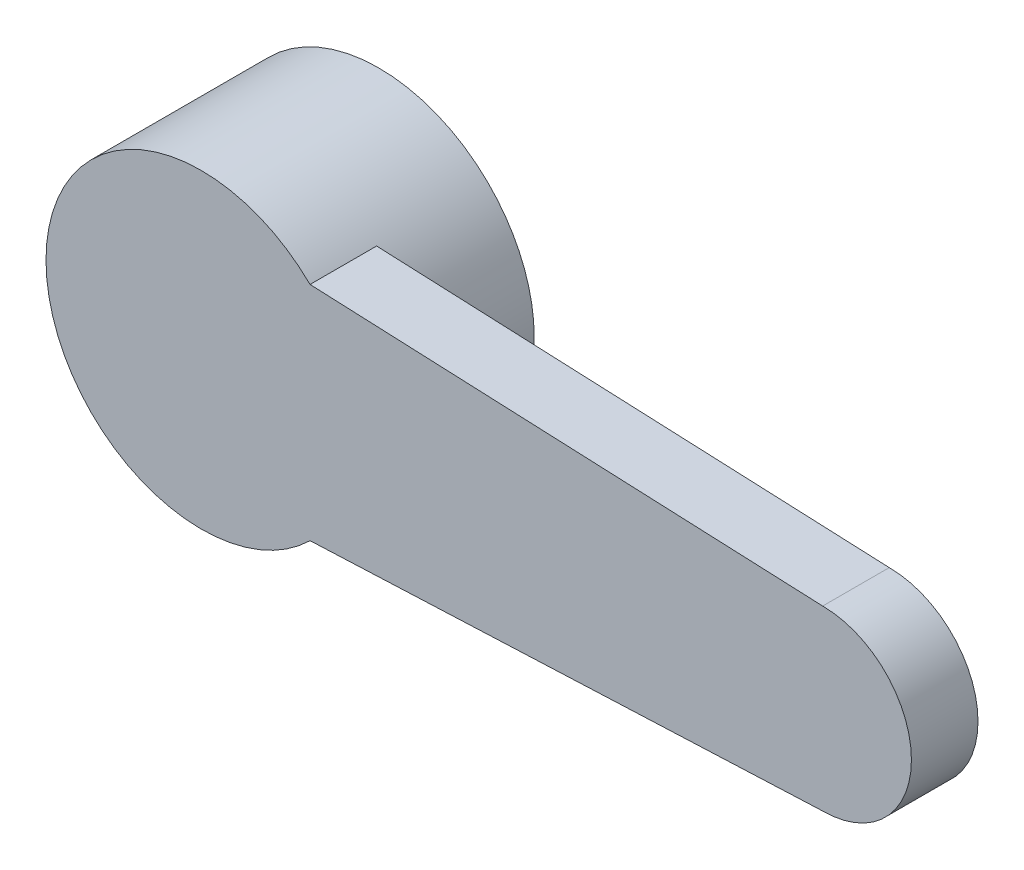
ISO-10303-21;
HEADER;
FILE_DESCRIPTION(('STEP AP214'),'2;1');
FILE_NAME('part.step','',(''),(''),'','','');
FILE_SCHEMA(('AUTOMOTIVE_DESIGN { 1 0 10303 214 1 1 1 1 }'));
ENDSEC;
DATA;
#1=APPLICATION_CONTEXT('core data for automotive mechanical design processes');
#2=APPLICATION_PROTOCOL_DEFINITION('international standard','automotive_design',2000,#1);
#3=PRODUCT_CONTEXT('',#1,'mechanical');
#4=PRODUCT('Part','Part','',(#3));
#5=PRODUCT_RELATED_PRODUCT_CATEGORY('part','',(#4));
#6=PRODUCT_DEFINITION_FORMATION('','',#4);
#7=PRODUCT_DEFINITION_CONTEXT('part definition',#1,'design');
#8=PRODUCT_DEFINITION('design','',#6,#7);
#9=PRODUCT_DEFINITION_SHAPE('','',#8);
#10=(LENGTH_UNIT() NAMED_UNIT(*) SI_UNIT(.MILLI.,.METRE.));
#11=(NAMED_UNIT(*) PLANE_ANGLE_UNIT() SI_UNIT($,.RADIAN.));
#12=(NAMED_UNIT(*) SI_UNIT($,.STERADIAN.) SOLID_ANGLE_UNIT());
#13=UNCERTAINTY_MEASURE_WITH_UNIT(LENGTH_MEASURE(1.E-05),#10,'distance_accuracy_value','');
#14=(GEOMETRIC_REPRESENTATION_CONTEXT(3) GLOBAL_UNCERTAINTY_ASSIGNED_CONTEXT((#13)) GLOBAL_UNIT_ASSIGNED_CONTEXT((#10,
#11,#12)) REPRESENTATION_CONTEXT('',''));
#15=CARTESIAN_POINT('',(0.,0.,0.));
#16=DIRECTION('',(0.,0.,1.));
#17=DIRECTION('',(1.,0.,0.));
#18=AXIS2_PLACEMENT_3D('',#15,#16,#17);
#19=CARTESIAN_POINT('',(0.,0.,4.));
#20=DIRECTION('',(0.,0.,-1.));
#21=DIRECTION('',(-1.,0.,0.));
#22=AXIS2_PLACEMENT_3D('',#19,#20,#21);
#23=CYLINDRICAL_SURFACE('',#22,3.5);
#24=CARTESIAN_POINT('',(0.,0.,4.));
#25=DIRECTION('',(0.,0.,1.));
#26=DIRECTION('',(1.,0.,0.));
#27=AXIS2_PLACEMENT_3D('',#24,#25,#26);
#28=CIRCLE('',#27,3.5);
#29=CARTESIAN_POINT('',(2.44948974278318,2.5,4.));
#30=VERTEX_POINT('',#29);
#31=CARTESIAN_POINT('',(2.44948974278318,-2.5,4.));
#32=VERTEX_POINT('',#31);
#33=EDGE_CURVE('E42',#30,#32,#28,.T.);
#34=ORIENTED_EDGE('',*,*,#33,.F.);
#35=DIRECTION('',(0.,0.,1.));
#36=VECTOR('',#35,1.);
#37=CARTESIAN_POINT('',(2.44948974278318,2.5,2.5));
#38=LINE('',#37,#36);
#39=CARTESIAN_POINT('',(2.44948974278318,2.5,2.5));
#40=VERTEX_POINT('',#39);
#41=EDGE_CURVE('E101',#40,#30,#38,.T.);
#42=ORIENTED_EDGE('',*,*,#41,.F.);
#43=CARTESIAN_POINT('',(0.,0.,2.5));
#44=DIRECTION('',(0.,0.,-1.));
#45=DIRECTION('',(-1.,0.,0.));
#46=AXIS2_PLACEMENT_3D('',#43,#44,#45);
#47=CIRCLE('',#46,3.5);
#48=CARTESIAN_POINT('',(2.44948974278318,-2.5,2.5));
#49=VERTEX_POINT('',#48);
#50=EDGE_CURVE('E11',#40,#49,#47,.T.);
#51=ORIENTED_EDGE('',*,*,#50,.T.);
#52=DIRECTION('',(0.,0.,1.));
#53=VECTOR('',#52,1.);
#54=CARTESIAN_POINT('',(2.44948974278318,-2.5,2.5));
#55=LINE('',#54,#53);
#56=EDGE_CURVE('E80',#49,#32,#55,.T.);
#57=ORIENTED_EDGE('',*,*,#56,.T.);
#58=EDGE_LOOP('',(#34,#42,#51,#57));
#59=FACE_BOUND('',#58,.T.);
#60=CARTESIAN_POINT('',(0.,0.,0.));
#61=DIRECTION('',(0.,0.,1.));
#62=DIRECTION('',(1.,0.,0.));
#63=AXIS2_PLACEMENT_3D('',#60,#61,#62);
#64=CIRCLE('',#63,3.5);
#65=CARTESIAN_POINT('',(3.5,0.,0.));
#66=VERTEX_POINT('',#65);
#67=EDGE_CURVE('E103',#66,#66,#64,.T.);
#68=ORIENTED_EDGE('',*,*,#67,.T.);
#69=EDGE_LOOP('',(#68));
#70=FACE_BOUND('',#69,.T.);
#71=ADVANCED_FACE('F35',(#59,#70),#23,.T.);
#72=CARTESIAN_POINT('',(0.,0.,4.));
#73=DIRECTION('',(0.,0.,1.));
#74=DIRECTION('',(1.,0.,0.));
#75=AXIS2_PLACEMENT_3D('',#72,#73,#74);
#76=PLANE('',#75);
#77=ORIENTED_EDGE('',*,*,#33,.T.);
#78=DIRECTION('',(0.999064383568617,0.0432476298155052,0.));
#79=VECTOR('',#78,1.);
#80=CARTESIAN_POINT('',(2.44948974278318,-2.5,4.));
#81=LINE('',#80,#79);
#82=CARTESIAN_POINT('',(14.,-2.,4.));
#83=VERTEX_POINT('',#82);
#84=EDGE_CURVE('E98',#32,#83,#81,.T.);
#85=ORIENTED_EDGE('',*,*,#84,.T.);
#86=CARTESIAN_POINT('',(14.,0.,4.));
#87=DIRECTION('',(0.,0.,1.));
#88=DIRECTION('',(-1.,0.,0.));
#89=AXIS2_PLACEMENT_3D('',#86,#87,#88);
#90=CIRCLE('',#89,2.);
#91=CARTESIAN_POINT('',(14.,2.,4.));
#92=VERTEX_POINT('',#91);
#93=EDGE_CURVE('E86',#83,#92,#90,.T.);
#94=ORIENTED_EDGE('',*,*,#93,.T.);
#95=DIRECTION('',(-0.999064383568617,0.0432476298155052,0.));
#96=VECTOR('',#95,1.);
#97=CARTESIAN_POINT('',(2.44948974278318,2.5,4.));
#98=LINE('',#97,#96);
#99=EDGE_CURVE('E49',#92,#30,#98,.T.);
#100=ORIENTED_EDGE('',*,*,#99,.T.);
#101=EDGE_LOOP('',(#77,#85,#94,#100));
#102=FACE_BOUND('',#101,.T.);
#103=ADVANCED_FACE('F113',(#102),#76,.T.);
#104=CARTESIAN_POINT('',(0.,0.,0.));
#105=DIRECTION('',(0.,0.,1.));
#106=DIRECTION('',(1.,0.,0.));
#107=AXIS2_PLACEMENT_3D('',#104,#105,#106);
#108=PLANE('',#107);
#109=ORIENTED_EDGE('',*,*,#67,.F.);
#110=EDGE_LOOP('',(#109));
#111=FACE_BOUND('',#110,.T.);
#112=ADVANCED_FACE('F110',(#111),#108,.F.);
#113=CARTESIAN_POINT('',(2.44948974278318,2.5,2.5));
#114=DIRECTION('',(0.0432476298155052,0.999064383568617,0.));
#115=DIRECTION('',(-0.999064383568617,0.0432476298155052,0.));
#116=AXIS2_PLACEMENT_3D('',#113,#114,#115);
#117=PLANE('',#116);
#118=ORIENTED_EDGE('',*,*,#99,.F.);
#119=DIRECTION('',(0.,0.,1.));
#120=VECTOR('',#119,1.);
#121=CARTESIAN_POINT('',(14.,2.,2.5));
#122=LINE('',#121,#120);
#123=CARTESIAN_POINT('',(14.,2.,2.5));
#124=VERTEX_POINT('',#123);
#125=EDGE_CURVE('E74',#124,#92,#122,.T.);
#126=ORIENTED_EDGE('',*,*,#125,.F.);
#127=DIRECTION('',(-0.999064383568617,0.0432476298155052,0.));
#128=VECTOR('',#127,1.);
#129=CARTESIAN_POINT('',(2.44948974278318,2.5,2.5));
#130=LINE('',#129,#128);
#131=EDGE_CURVE('E91',#124,#40,#130,.T.);
#132=ORIENTED_EDGE('',*,*,#131,.T.);
#133=ORIENTED_EDGE('',*,*,#41,.T.);
#134=EDGE_LOOP('',(#118,#126,#132,#133));
#135=FACE_BOUND('',#134,.T.);
#136=ADVANCED_FACE('F112',(#135),#117,.T.);
#137=CARTESIAN_POINT('',(14.,0.,2.5));
#138=DIRECTION('',(0.,0.,1.));
#139=DIRECTION('',(1.,0.,0.));
#140=AXIS2_PLACEMENT_3D('',#137,#138,#139);
#141=CYLINDRICAL_SURFACE('',#140,2.);
#142=ORIENTED_EDGE('',*,*,#93,.F.);
#143=DIRECTION('',(0.,0.,1.));
#144=VECTOR('',#143,1.);
#145=CARTESIAN_POINT('',(14.,-2.,2.5));
#146=LINE('',#145,#144);
#147=CARTESIAN_POINT('',(14.,-2.,2.5));
#148=VERTEX_POINT('',#147);
#149=EDGE_CURVE('E82',#148,#83,#146,.T.);
#150=ORIENTED_EDGE('',*,*,#149,.F.);
#151=CARTESIAN_POINT('',(14.,0.,2.5));
#152=DIRECTION('',(0.,0.,1.));
#153=DIRECTION('',(-1.,0.,0.));
#154=AXIS2_PLACEMENT_3D('',#151,#152,#153);
#155=CIRCLE('',#154,2.);
#156=EDGE_CURVE('E85',#148,#124,#155,.T.);
#157=ORIENTED_EDGE('',*,*,#156,.T.);
#158=ORIENTED_EDGE('',*,*,#125,.T.);
#159=EDGE_LOOP('',(#142,#150,#157,#158));
#160=FACE_BOUND('',#159,.T.);
#161=ADVANCED_FACE('F84',(#160),#141,.T.);
#162=CARTESIAN_POINT('',(2.44948974278318,-2.5,2.5));
#163=DIRECTION('',(0.0432476298155052,-0.999064383568617,0.));
#164=DIRECTION('',(0.999064383568617,0.0432476298155052,0.));
#165=AXIS2_PLACEMENT_3D('',#162,#163,#164);
#166=PLANE('',#165);
#167=ORIENTED_EDGE('',*,*,#84,.F.);
#168=ORIENTED_EDGE('',*,*,#56,.F.);
#169=DIRECTION('',(0.999064383568617,0.0432476298155052,0.));
#170=VECTOR('',#169,1.);
#171=CARTESIAN_POINT('',(2.44948974278318,-2.5,2.5));
#172=LINE('',#171,#170);
#173=EDGE_CURVE('E90',#49,#148,#172,.T.);
#174=ORIENTED_EDGE('',*,*,#173,.T.);
#175=ORIENTED_EDGE('',*,*,#149,.T.);
#176=EDGE_LOOP('',(#167,#168,#174,#175));
#177=FACE_BOUND('',#176,.T.);
#178=ADVANCED_FACE('F93',(#177),#166,.T.);
#179=CARTESIAN_POINT('',(14.,0.,2.5));
#180=DIRECTION('',(0.,0.,-1.));
#181=DIRECTION('',(-1.,0.,0.));
#182=AXIS2_PLACEMENT_3D('',#179,#180,#181);
#183=PLANE('',#182);
#184=ORIENTED_EDGE('',*,*,#50,.F.);
#185=ORIENTED_EDGE('',*,*,#131,.F.);
#186=ORIENTED_EDGE('',*,*,#156,.F.);
#187=ORIENTED_EDGE('',*,*,#173,.F.);
#188=EDGE_LOOP('',(#184,#185,#186,#187));
#189=FACE_BOUND('',#188,.T.);
#190=ADVANCED_FACE('F89',(#189),#183,.T.);
#191=CLOSED_SHELL('',(#71,#103,#112,#136,#161,#178,#190));
#192=MANIFOLD_SOLID_BREP('B2',#191);
#193=ADVANCED_BREP_SHAPE_REPRESENTATION('',(#18,#192),#14);
#194=SHAPE_DEFINITION_REPRESENTATION(#9,#193);
ENDSEC;
END-ISO-10303-21;
